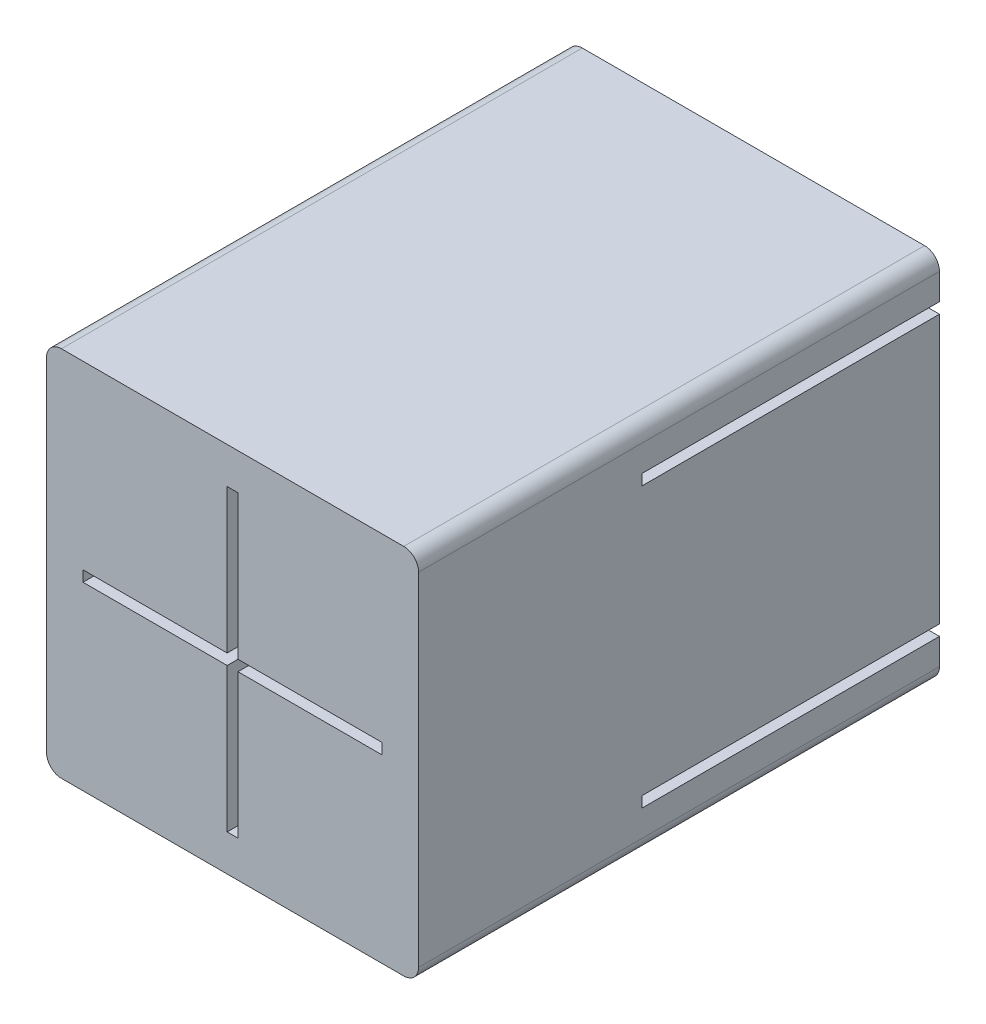
ISO-10303-21;
HEADER;
FILE_DESCRIPTION(('STEP AP214'),'2;1');
FILE_NAME('part.step','',(''),(''),'','','');
FILE_SCHEMA(('AUTOMOTIVE_DESIGN { 1 0 10303 214 1 1 1 1 }'));
ENDSEC;
DATA;
#1=APPLICATION_CONTEXT('core data for automotive mechanical design processes');
#2=APPLICATION_PROTOCOL_DEFINITION('international standard','automotive_design',2000,#1);
#3=PRODUCT_CONTEXT('',#1,'mechanical');
#4=PRODUCT('Part','Part','',(#3));
#5=PRODUCT_RELATED_PRODUCT_CATEGORY('part','',(#4));
#6=PRODUCT_DEFINITION_FORMATION('','',#4);
#7=PRODUCT_DEFINITION_CONTEXT('part definition',#1,'design');
#8=PRODUCT_DEFINITION('design','',#6,#7);
#9=PRODUCT_DEFINITION_SHAPE('','',#8);
#10=(LENGTH_UNIT() NAMED_UNIT(*) SI_UNIT(.MILLI.,.METRE.));
#11=(NAMED_UNIT(*) PLANE_ANGLE_UNIT() SI_UNIT($,.RADIAN.));
#12=(NAMED_UNIT(*) SI_UNIT($,.STERADIAN.) SOLID_ANGLE_UNIT());
#13=UNCERTAINTY_MEASURE_WITH_UNIT(LENGTH_MEASURE(1.E-05),#10,'distance_accuracy_value','');
#14=(GEOMETRIC_REPRESENTATION_CONTEXT(3) GLOBAL_UNCERTAINTY_ASSIGNED_CONTEXT((#13)) GLOBAL_UNIT_ASSIGNED_CONTEXT((#10,
#11,#12)) REPRESENTATION_CONTEXT('',''));
#15=CARTESIAN_POINT('',(0.,0.,0.));
#16=DIRECTION('',(0.,0.,1.));
#17=DIRECTION('',(1.,0.,0.));
#18=AXIS2_PLACEMENT_3D('',#15,#16,#17);
#19=CARTESIAN_POINT('',(31.75,0.,25.4));
#20=DIRECTION('',(-1.,0.,0.));
#21=DIRECTION('',(0.,0.,1.));
#22=AXIS2_PLACEMENT_3D('',#19,#20,#21);
#23=PLANE('',#22);
#24=DIRECTION('',(0.,1.,0.));
#25=VECTOR('',#24,1.);
#26=CARTESIAN_POINT('',(31.75,0.,-63.5));
#27=LINE('',#26,#25);
#28=CARTESIAN_POINT('',(31.75,24.73325,-63.5));
#29=VERTEX_POINT('',#28);
#30=CARTESIAN_POINT('',(31.75,29.21,-63.5));
#31=VERTEX_POINT('',#30);
#32=EDGE_CURVE('E300',#29,#31,#27,.T.);
#33=ORIENTED_EDGE('',*,*,#32,.T.);
#34=DIRECTION('',(0.,0.,-1.));
#35=VECTOR('',#34,1.);
#36=CARTESIAN_POINT('',(31.75,29.21,25.4));
#37=LINE('',#36,#35);
#38=CARTESIAN_POINT('',(31.75,29.21,25.4));
#39=VERTEX_POINT('',#38);
#40=EDGE_CURVE('E420',#31,#39,#37,.F.);
#41=ORIENTED_EDGE('',*,*,#40,.T.);
#42=DIRECTION('',(0.,1.,0.));
#43=VECTOR('',#42,1.);
#44=CARTESIAN_POINT('',(31.75,0.,25.4));
#45=LINE('',#44,#43);
#46=CARTESIAN_POINT('',(31.75,-29.21,25.4));
#47=VERTEX_POINT('',#46);
#48=EDGE_CURVE('E338',#47,#39,#45,.T.);
#49=ORIENTED_EDGE('',*,*,#48,.F.);
#50=DIRECTION('',(0.,0.,-1.));
#51=VECTOR('',#50,1.);
#52=CARTESIAN_POINT('',(31.75,-29.21,25.4));
#53=LINE('',#52,#51);
#54=CARTESIAN_POINT('',(31.75,-29.21,-63.5));
#55=VERTEX_POINT('',#54);
#56=EDGE_CURVE('E417',#47,#55,#53,.T.);
#57=ORIENTED_EDGE('',*,*,#56,.T.);
#58=CARTESIAN_POINT('',(31.75,-24.73325,-63.5));
#59=VERTEX_POINT('',#58);
#60=EDGE_CURVE('E301',#55,#59,#27,.T.);
#61=ORIENTED_EDGE('',*,*,#60,.T.);
#62=DIRECTION('',(0.,0.,1.));
#63=VECTOR('',#62,1.);
#64=CARTESIAN_POINT('',(31.75,-24.73325,-63.5));
#65=LINE('',#64,#63);
#66=CARTESIAN_POINT('',(31.75,-24.73325,-12.7));
#67=VERTEX_POINT('',#66);
#68=EDGE_CURVE('E285',#59,#67,#65,.T.);
#69=ORIENTED_EDGE('',*,*,#68,.T.);
#70=DIRECTION('',(0.,-1.,0.));
#71=VECTOR('',#70,1.);
#72=CARTESIAN_POINT('',(31.75,-22.89175,-12.7));
#73=LINE('',#72,#71);
#74=CARTESIAN_POINT('',(31.75,-22.89175,-12.7));
#75=VERTEX_POINT('',#74);
#76=EDGE_CURVE('E294',#75,#67,#73,.T.);
#77=ORIENTED_EDGE('',*,*,#76,.F.);
#78=DIRECTION('',(0.,0.,1.));
#79=VECTOR('',#78,1.);
#80=CARTESIAN_POINT('',(31.75,-22.89175,-63.5));
#81=LINE('',#80,#79);
#82=CARTESIAN_POINT('',(31.75,-22.89175,-63.5));
#83=VERTEX_POINT('',#82);
#84=EDGE_CURVE('E273',#83,#75,#81,.T.);
#85=ORIENTED_EDGE('',*,*,#84,.F.);
#86=CARTESIAN_POINT('',(31.75,22.89175,-63.5));
#87=VERTEX_POINT('',#86);
#88=EDGE_CURVE('E249',#83,#87,#27,.T.);
#89=ORIENTED_EDGE('',*,*,#88,.T.);
#90=DIRECTION('',(0.,0.,1.));
#91=VECTOR('',#90,1.);
#92=CARTESIAN_POINT('',(31.75,22.89175,0.));
#93=LINE('',#92,#91);
#94=CARTESIAN_POINT('',(31.75,22.89175,-12.7));
#95=VERTEX_POINT('',#94);
#96=EDGE_CURVE('E229',#87,#95,#93,.T.);
#97=ORIENTED_EDGE('',*,*,#96,.T.);
#98=DIRECTION('',(0.,1.,0.));
#99=VECTOR('',#98,1.);
#100=CARTESIAN_POINT('',(31.75,0.,-12.7));
#101=LINE('',#100,#99);
#102=CARTESIAN_POINT('',(31.75,24.73325,-12.7));
#103=VERTEX_POINT('',#102);
#104=EDGE_CURVE('E240',#95,#103,#101,.T.);
#105=ORIENTED_EDGE('',*,*,#104,.T.);
#106=DIRECTION('',(0.,0.,1.));
#107=VECTOR('',#106,1.);
#108=CARTESIAN_POINT('',(31.75,24.73325,0.));
#109=LINE('',#108,#107);
#110=EDGE_CURVE('E236',#29,#103,#109,.T.);
#111=ORIENTED_EDGE('',*,*,#110,.F.);
#112=EDGE_LOOP('',(#33,#41,#49,#57,#61,#69,#77,#85,#89,#97,#105,#111));
#113=FACE_BOUND('',#112,.T.);
#114=ADVANCED_FACE('F40',(#113),#23,.F.);
#115=CARTESIAN_POINT('',(0.,0.,-63.5));
#116=DIRECTION('',(0.,0.,1.));
#117=DIRECTION('',(1.,0.,0.));
#118=AXIS2_PLACEMENT_3D('',#115,#116,#117);
#119=PLANE('',#118);
#120=DIRECTION('',(1.,0.,0.));
#121=VECTOR('',#120,1.);
#122=CARTESIAN_POINT('',(0.,31.75,-63.5));
#123=LINE('',#122,#121);
#124=CARTESIAN_POINT('',(-29.21,31.75,-63.5));
#125=VERTEX_POINT('',#124);
#126=CARTESIAN_POINT('',(29.21,31.75,-63.5));
#127=VERTEX_POINT('',#126);
#128=EDGE_CURVE('E303',#125,#127,#123,.T.);
#129=ORIENTED_EDGE('',*,*,#128,.T.);
#130=CARTESIAN_POINT('',(29.21,29.21,-63.5));
#131=DIRECTION('',(0.,0.,1.));
#132=DIRECTION('',(1.,0.,0.));
#133=AXIS2_PLACEMENT_3D('',#130,#131,#132);
#134=CIRCLE('',#133,2.54);
#135=EDGE_CURVE('E415',#127,#31,#134,.F.);
#136=ORIENTED_EDGE('',*,*,#135,.T.);
#137=ORIENTED_EDGE('',*,*,#32,.F.);
#138=DIRECTION('',(-1.,0.,0.));
#139=VECTOR('',#138,1.);
#140=CARTESIAN_POINT('',(31.75,24.73325,-63.5));
#141=LINE('',#140,#139);
#142=CARTESIAN_POINT('',(-25.4,24.73325,-63.5));
#143=VERTEX_POINT('',#142);
#144=EDGE_CURVE('E266',#29,#143,#141,.T.);
#145=ORIENTED_EDGE('',*,*,#144,.T.);
#146=DIRECTION('',(0.,-1.,0.));
#147=VECTOR('',#146,1.);
#148=CARTESIAN_POINT('',(-25.4,0.,-63.5));
#149=LINE('',#148,#147);
#150=CARTESIAN_POINT('',(-25.4,22.89175,-63.5));
#151=VERTEX_POINT('',#150);
#152=EDGE_CURVE('E250',#143,#151,#149,.T.);
#153=ORIENTED_EDGE('',*,*,#152,.T.);
#154=DIRECTION('',(-1.,0.,0.));
#155=VECTOR('',#154,1.);
#156=CARTESIAN_POINT('',(31.75,22.89175,-63.5));
#157=LINE('',#156,#155);
#158=EDGE_CURVE('E263',#87,#151,#157,.T.);
#159=ORIENTED_EDGE('',*,*,#158,.F.);
#160=ORIENTED_EDGE('',*,*,#88,.F.);
#161=DIRECTION('',(-1.,0.,0.));
#162=VECTOR('',#161,1.);
#163=CARTESIAN_POINT('',(31.75,-22.89175,-63.5));
#164=LINE('',#163,#162);
#165=CARTESIAN_POINT('',(-25.4,-22.89175,-63.5));
#166=VERTEX_POINT('',#165);
#167=EDGE_CURVE('E279',#83,#166,#164,.T.);
#168=ORIENTED_EDGE('',*,*,#167,.T.);
#169=DIRECTION('',(0.,-1.,0.));
#170=VECTOR('',#169,1.);
#171=CARTESIAN_POINT('',(-25.4,-22.89175,-63.5));
#172=LINE('',#171,#170);
#173=CARTESIAN_POINT('',(-25.4,-24.73325,-63.5));
#174=VERTEX_POINT('',#173);
#175=EDGE_CURVE('E259',#166,#174,#172,.T.);
#176=ORIENTED_EDGE('',*,*,#175,.T.);
#177=DIRECTION('',(-1.,0.,0.));
#178=VECTOR('',#177,1.);
#179=CARTESIAN_POINT('',(31.75,-24.73325,-63.5));
#180=LINE('',#179,#178);
#181=EDGE_CURVE('E270',#59,#174,#180,.T.);
#182=ORIENTED_EDGE('',*,*,#181,.F.);
#183=ORIENTED_EDGE('',*,*,#60,.F.);
#184=CARTESIAN_POINT('',(29.21,-29.21,-63.5));
#185=DIRECTION('',(0.,0.,1.));
#186=DIRECTION('',(1.,0.,0.));
#187=AXIS2_PLACEMENT_3D('',#184,#185,#186);
#188=CIRCLE('',#187,2.54);
#189=CARTESIAN_POINT('',(29.21,-31.75,-63.5));
#190=VERTEX_POINT('',#189);
#191=EDGE_CURVE('E413',#55,#190,#188,.F.);
#192=ORIENTED_EDGE('',*,*,#191,.T.);
#193=DIRECTION('',(1.,0.,0.));
#194=VECTOR('',#193,1.);
#195=CARTESIAN_POINT('',(0.,-31.75,-63.5));
#196=LINE('',#195,#194);
#197=CARTESIAN_POINT('',(-29.21,-31.75,-63.5));
#198=VERTEX_POINT('',#197);
#199=EDGE_CURVE('E265',#198,#190,#196,.T.);
#200=ORIENTED_EDGE('',*,*,#199,.F.);
#201=CARTESIAN_POINT('',(-29.21,-29.21,-63.5));
#202=DIRECTION('',(0.,0.,1.));
#203=DIRECTION('',(1.,0.,0.));
#204=AXIS2_PLACEMENT_3D('',#201,#202,#203);
#205=CIRCLE('',#204,2.54);
#206=CARTESIAN_POINT('',(-31.75,-29.21,-63.5));
#207=VERTEX_POINT('',#206);
#208=EDGE_CURVE('E411',#198,#207,#205,.F.);
#209=ORIENTED_EDGE('',*,*,#208,.T.);
#210=DIRECTION('',(0.,1.,0.));
#211=VECTOR('',#210,1.);
#212=CARTESIAN_POINT('',(-31.75,0.,-63.5));
#213=LINE('',#212,#211);
#214=CARTESIAN_POINT('',(-31.75,29.21,-63.5));
#215=VERTEX_POINT('',#214);
#216=EDGE_CURVE('E306',#207,#215,#213,.T.);
#217=ORIENTED_EDGE('',*,*,#216,.T.);
#218=CARTESIAN_POINT('',(-29.21,29.21,-63.5));
#219=DIRECTION('',(0.,0.,1.));
#220=DIRECTION('',(1.,0.,0.));
#221=AXIS2_PLACEMENT_3D('',#218,#219,#220);
#222=CIRCLE('',#221,2.54);
#223=EDGE_CURVE('E409',#215,#125,#222,.F.);
#224=ORIENTED_EDGE('',*,*,#223,.T.);
#225=EDGE_LOOP('',(#129,#136,#137,#145,#153,#159,#160,#168,#176,#182,#183,#192,#200,#209,#217,#224));
#226=FACE_BOUND('',#225,.T.);
#227=ADVANCED_FACE('F438',(#226),#119,.F.);
#228=CARTESIAN_POINT('',(0.,-31.75,25.4));
#229=DIRECTION('',(0.,1.,0.));
#230=DIRECTION('',(0.,0.,1.));
#231=AXIS2_PLACEMENT_3D('',#228,#229,#230);
#232=PLANE('',#231);
#233=ORIENTED_EDGE('',*,*,#199,.T.);
#234=DIRECTION('',(0.,0.,-1.));
#235=VECTOR('',#234,1.);
#236=CARTESIAN_POINT('',(29.21,-31.75,25.4));
#237=LINE('',#236,#235);
#238=CARTESIAN_POINT('',(29.21,-31.75,25.4));
#239=VERTEX_POINT('',#238);
#240=EDGE_CURVE('E432',#190,#239,#237,.F.);
#241=ORIENTED_EDGE('',*,*,#240,.T.);
#242=DIRECTION('',(1.,0.,0.));
#243=VECTOR('',#242,1.);
#244=CARTESIAN_POINT('',(0.,-31.75,25.4));
#245=LINE('',#244,#243);
#246=CARTESIAN_POINT('',(-29.21,-31.75,25.4));
#247=VERTEX_POINT('',#246);
#248=EDGE_CURVE('E335',#247,#239,#245,.T.);
#249=ORIENTED_EDGE('',*,*,#248,.F.);
#250=DIRECTION('',(0.,0.,-1.));
#251=VECTOR('',#250,1.);
#252=CARTESIAN_POINT('',(-29.21,-31.75,-63.5));
#253=LINE('',#252,#251);
#254=EDGE_CURVE('E429',#247,#198,#253,.T.);
#255=ORIENTED_EDGE('',*,*,#254,.T.);
#256=EDGE_LOOP('',(#233,#241,#249,#255));
#257=FACE_BOUND('',#256,.T.);
#258=ADVANCED_FACE('F447',(#257),#232,.F.);
#259=CARTESIAN_POINT('',(0.,31.75,25.4));
#260=DIRECTION('',(0.,1.,0.));
#261=DIRECTION('',(0.,0.,1.));
#262=AXIS2_PLACEMENT_3D('',#259,#260,#261);
#263=PLANE('',#262);
#264=DIRECTION('',(1.,0.,0.));
#265=VECTOR('',#264,1.);
#266=CARTESIAN_POINT('',(0.,31.75,25.4));
#267=LINE('',#266,#265);
#268=CARTESIAN_POINT('',(-29.21,31.75,25.4));
#269=VERTEX_POINT('',#268);
#270=CARTESIAN_POINT('',(29.21,31.75,25.4));
#271=VERTEX_POINT('',#270);
#272=EDGE_CURVE('E341',#269,#271,#267,.T.);
#273=ORIENTED_EDGE('',*,*,#272,.T.);
#274=DIRECTION('',(0.,0.,-1.));
#275=VECTOR('',#274,1.);
#276=CARTESIAN_POINT('',(29.21,31.75,-63.5));
#277=LINE('',#276,#275);
#278=EDGE_CURVE('E406',#271,#127,#277,.T.);
#279=ORIENTED_EDGE('',*,*,#278,.T.);
#280=ORIENTED_EDGE('',*,*,#128,.F.);
#281=DIRECTION('',(0.,0.,-1.));
#282=VECTOR('',#281,1.);
#283=CARTESIAN_POINT('',(-29.21,31.75,25.4));
#284=LINE('',#283,#282);
#285=EDGE_CURVE('E404',#125,#269,#284,.F.);
#286=ORIENTED_EDGE('',*,*,#285,.T.);
#287=EDGE_LOOP('',(#273,#279,#280,#286));
#288=FACE_BOUND('',#287,.T.);
#289=ADVANCED_FACE('F476',(#288),#263,.T.);
#290=CARTESIAN_POINT('',(-25.527,0.,25.4));
#291=DIRECTION('',(1.,0.,0.));
#292=DIRECTION('',(0.,1.,0.));
#293=AXIS2_PLACEMENT_3D('',#290,#291,#292);
#294=PLANE('',#293);
#295=DIRECTION('',(0.,-1.,0.));
#296=VECTOR('',#295,1.);
#297=CARTESIAN_POINT('',(-25.527,0.,0.));
#298=LINE('',#297,#296);
#299=CARTESIAN_POINT('',(-25.527,0.920750000000089,0.));
#300=VERTEX_POINT('',#299);
#301=CARTESIAN_POINT('',(-25.527,-0.920749999999911,0.));
#302=VERTEX_POINT('',#301);
#303=EDGE_CURVE('E309',#300,#302,#298,.T.);
#304=ORIENTED_EDGE('',*,*,#303,.F.);
#305=DIRECTION('',(0.,0.,-1.));
#306=VECTOR('',#305,1.);
#307=CARTESIAN_POINT('',(-25.527,0.920750000000089,25.4));
#308=LINE('',#307,#306);
#309=CARTESIAN_POINT('',(-25.527,0.920750000000089,25.4));
#310=VERTEX_POINT('',#309);
#311=EDGE_CURVE('E401',#310,#300,#308,.T.);
#312=ORIENTED_EDGE('',*,*,#311,.F.);
#313=DIRECTION('',(0.,-1.,0.));
#314=VECTOR('',#313,1.);
#315=CARTESIAN_POINT('',(-25.527,0.,25.4));
#316=LINE('',#315,#314);
#317=CARTESIAN_POINT('',(-25.527,-0.920749999999911,25.4));
#318=VERTEX_POINT('',#317);
#319=EDGE_CURVE('E310',#310,#318,#316,.T.);
#320=ORIENTED_EDGE('',*,*,#319,.T.);
#321=DIRECTION('',(0.,0.,-1.));
#322=VECTOR('',#321,1.);
#323=CARTESIAN_POINT('',(-25.527,-0.920749999999911,25.4));
#324=LINE('',#323,#322);
#325=EDGE_CURVE('E346',#318,#302,#324,.T.);
#326=ORIENTED_EDGE('',*,*,#325,.T.);
#327=EDGE_LOOP('',(#304,#312,#320,#326));
#328=FACE_BOUND('',#327,.T.);
#329=ADVANCED_FACE('F525',(#328),#294,.T.);
#330=CARTESIAN_POINT('',(0.,0.92075,25.4));
#331=DIRECTION('',(0.,1.,0.));
#332=DIRECTION('',(-1.,0.,0.));
#333=AXIS2_PLACEMENT_3D('',#330,#331,#332);
#334=PLANE('',#333);
#335=DIRECTION('',(1.,0.,0.));
#336=VECTOR('',#335,1.);
#337=CARTESIAN_POINT('',(0.,0.92075,0.));
#338=LINE('',#337,#336);
#339=CARTESIAN_POINT('',(-0.92075,0.92075,0.));
#340=VERTEX_POINT('',#339);
#341=EDGE_CURVE('E348',#300,#340,#338,.T.);
#342=ORIENTED_EDGE('',*,*,#341,.T.);
#343=DIRECTION('',(0.,0.,-1.));
#344=VECTOR('',#343,1.);
#345=CARTESIAN_POINT('',(-0.92075,0.92075,25.4));
#346=LINE('',#345,#344);
#347=CARTESIAN_POINT('',(-0.92075,0.92075,25.4));
#348=VERTEX_POINT('',#347);
#349=EDGE_CURVE('E398',#348,#340,#346,.T.);
#350=ORIENTED_EDGE('',*,*,#349,.F.);
#351=DIRECTION('',(1.,0.,0.));
#352=VECTOR('',#351,1.);
#353=CARTESIAN_POINT('',(0.,0.92075,25.4));
#354=LINE('',#353,#352);
#355=EDGE_CURVE('E313',#310,#348,#354,.T.);
#356=ORIENTED_EDGE('',*,*,#355,.F.);
#357=ORIENTED_EDGE('',*,*,#311,.T.);
#358=EDGE_LOOP('',(#342,#350,#356,#357));
#359=FACE_BOUND('',#358,.T.);
#360=ADVANCED_FACE('F520',(#359),#334,.F.);
#361=CARTESIAN_POINT('',(-0.92075,0.,25.4));
#362=DIRECTION('',(-1.,0.,0.));
#363=DIRECTION('',(0.,-1.,0.));
#364=AXIS2_PLACEMENT_3D('',#361,#362,#363);
#365=PLANE('',#364);
#366=DIRECTION('',(0.,1.,0.));
#367=VECTOR('',#366,1.);
#368=CARTESIAN_POINT('',(-0.92075,0.,0.));
#369=LINE('',#368,#367);
#370=CARTESIAN_POINT('',(-0.92075,25.527,0.));
#371=VERTEX_POINT('',#370);
#372=EDGE_CURVE('E351',#340,#371,#369,.T.);
#373=ORIENTED_EDGE('',*,*,#372,.T.);
#374=DIRECTION('',(0.,0.,-1.));
#375=VECTOR('',#374,1.);
#376=CARTESIAN_POINT('',(-0.92075,25.527,25.4));
#377=LINE('',#376,#375);
#378=CARTESIAN_POINT('',(-0.92075,25.527,25.4));
#379=VERTEX_POINT('',#378);
#380=EDGE_CURVE('E395',#379,#371,#377,.T.);
#381=ORIENTED_EDGE('',*,*,#380,.F.);
#382=DIRECTION('',(0.,1.,0.));
#383=VECTOR('',#382,1.);
#384=CARTESIAN_POINT('',(-0.92075,0.,25.4));
#385=LINE('',#384,#383);
#386=EDGE_CURVE('E316',#348,#379,#385,.T.);
#387=ORIENTED_EDGE('',*,*,#386,.F.);
#388=ORIENTED_EDGE('',*,*,#349,.T.);
#389=EDGE_LOOP('',(#373,#381,#387,#388));
#390=FACE_BOUND('',#389,.T.);
#391=ADVANCED_FACE('F503',(#390),#365,.F.);
#392=CARTESIAN_POINT('',(0.,25.527,25.4));
#393=DIRECTION('',(0.,1.,0.));
#394=DIRECTION('',(0.,0.,1.));
#395=AXIS2_PLACEMENT_3D('',#392,#393,#394);
#396=PLANE('',#395);
#397=DIRECTION('',(1.,0.,0.));
#398=VECTOR('',#397,1.);
#399=CARTESIAN_POINT('',(0.,25.527,0.));
#400=LINE('',#399,#398);
#401=CARTESIAN_POINT('',(0.92075,25.527,0.));
#402=VERTEX_POINT('',#401);
#403=EDGE_CURVE('E355',#371,#402,#400,.T.);
#404=ORIENTED_EDGE('',*,*,#403,.T.);
#405=DIRECTION('',(0.,0.,-1.));
#406=VECTOR('',#405,1.);
#407=CARTESIAN_POINT('',(0.92075,25.527,25.4));
#408=LINE('',#407,#406);
#409=CARTESIAN_POINT('',(0.92075,25.527,25.4));
#410=VERTEX_POINT('',#409);
#411=EDGE_CURVE('E392',#410,#402,#408,.T.);
#412=ORIENTED_EDGE('',*,*,#411,.F.);
#413=DIRECTION('',(1.,0.,0.));
#414=VECTOR('',#413,1.);
#415=CARTESIAN_POINT('',(0.,25.527,25.4));
#416=LINE('',#415,#414);
#417=EDGE_CURVE('E319',#379,#410,#416,.T.);
#418=ORIENTED_EDGE('',*,*,#417,.F.);
#419=ORIENTED_EDGE('',*,*,#380,.T.);
#420=EDGE_LOOP('',(#404,#412,#418,#419));
#421=FACE_BOUND('',#420,.T.);
#422=ADVANCED_FACE('F521',(#421),#396,.F.);
#423=CARTESIAN_POINT('',(0.92075,0.,25.4));
#424=DIRECTION('',(-1.,0.,0.));
#425=DIRECTION('',(0.,0.,1.));
#426=AXIS2_PLACEMENT_3D('',#423,#424,#425);
#427=PLANE('',#426);
#428=DIRECTION('',(0.,1.,0.));
#429=VECTOR('',#428,1.);
#430=CARTESIAN_POINT('',(0.92075,0.,0.));
#431=LINE('',#430,#429);
#432=CARTESIAN_POINT('',(0.92075,0.92075,0.));
#433=VERTEX_POINT('',#432);
#434=EDGE_CURVE('E359',#433,#402,#431,.T.);
#435=ORIENTED_EDGE('',*,*,#434,.F.);
#436=DIRECTION('',(0.,0.,-1.));
#437=VECTOR('',#436,1.);
#438=CARTESIAN_POINT('',(0.92075,0.92075,25.4));
#439=LINE('',#438,#437);
#440=CARTESIAN_POINT('',(0.92075,0.92075,25.4));
#441=VERTEX_POINT('',#440);
#442=EDGE_CURVE('E389',#441,#433,#439,.T.);
#443=ORIENTED_EDGE('',*,*,#442,.F.);
#444=DIRECTION('',(0.,1.,0.));
#445=VECTOR('',#444,1.);
#446=CARTESIAN_POINT('',(0.92075,0.,25.4));
#447=LINE('',#446,#445);
#448=EDGE_CURVE('E322',#441,#410,#447,.T.);
#449=ORIENTED_EDGE('',*,*,#448,.T.);
#450=ORIENTED_EDGE('',*,*,#411,.T.);
#451=EDGE_LOOP('',(#435,#443,#449,#450));
#452=FACE_BOUND('',#451,.T.);
#453=ADVANCED_FACE('F511',(#452),#427,.T.);
#454=CARTESIAN_POINT('',(25.527,0.920749999999911,0.));
#455=VERTEX_POINT('',#454);
#456=EDGE_CURVE('E352',#433,#455,#338,.T.);
#457=ORIENTED_EDGE('',*,*,#456,.T.);
#458=DIRECTION('',(0.,0.,-1.));
#459=VECTOR('',#458,1.);
#460=CARTESIAN_POINT('',(25.527,0.920749999999911,25.4));
#461=LINE('',#460,#459);
#462=CARTESIAN_POINT('',(25.527,0.920749999999911,25.4));
#463=VERTEX_POINT('',#462);
#464=EDGE_CURVE('E386',#463,#455,#461,.T.);
#465=ORIENTED_EDGE('',*,*,#464,.F.);
#466=EDGE_CURVE('E317',#441,#463,#354,.T.);
#467=ORIENTED_EDGE('',*,*,#466,.F.);
#468=ORIENTED_EDGE('',*,*,#442,.T.);
#469=EDGE_LOOP('',(#457,#465,#467,#468));
#470=FACE_BOUND('',#469,.T.);
#471=ADVANCED_FACE('F515',(#470),#334,.F.);
#472=CARTESIAN_POINT('',(25.527,0.,25.4));
#473=DIRECTION('',(1.,0.,0.));
#474=DIRECTION('',(0.,1.,0.));
#475=AXIS2_PLACEMENT_3D('',#472,#473,#474);
#476=PLANE('',#475);
#477=DIRECTION('',(0.,-1.,0.));
#478=VECTOR('',#477,1.);
#479=CARTESIAN_POINT('',(25.527,0.,0.));
#480=LINE('',#479,#478);
#481=CARTESIAN_POINT('',(25.527,-0.920750000000089,0.));
#482=VERTEX_POINT('',#481);
#483=EDGE_CURVE('E362',#455,#482,#480,.T.);
#484=ORIENTED_EDGE('',*,*,#483,.T.);
#485=DIRECTION('',(0.,0.,-1.));
#486=VECTOR('',#485,1.);
#487=CARTESIAN_POINT('',(25.527,-0.920750000000089,25.4));
#488=LINE('',#487,#486);
#489=CARTESIAN_POINT('',(25.527,-0.920750000000089,25.4));
#490=VERTEX_POINT('',#489);
#491=EDGE_CURVE('E383',#490,#482,#488,.T.);
#492=ORIENTED_EDGE('',*,*,#491,.F.);
#493=DIRECTION('',(0.,-1.,0.));
#494=VECTOR('',#493,1.);
#495=CARTESIAN_POINT('',(25.527,0.,25.4));
#496=LINE('',#495,#494);
#497=EDGE_CURVE('E326',#463,#490,#496,.T.);
#498=ORIENTED_EDGE('',*,*,#497,.F.);
#499=ORIENTED_EDGE('',*,*,#464,.T.);
#500=EDGE_LOOP('',(#484,#492,#498,#499));
#501=FACE_BOUND('',#500,.T.);
#502=ADVANCED_FACE('F512',(#501),#476,.F.);
#503=CARTESIAN_POINT('',(0.,-0.92075,25.4));
#504=DIRECTION('',(0.,1.,0.));
#505=DIRECTION('',(-1.,0.,0.));
#506=AXIS2_PLACEMENT_3D('',#503,#504,#505);
#507=PLANE('',#506);
#508=DIRECTION('',(1.,0.,0.));
#509=VECTOR('',#508,1.);
#510=CARTESIAN_POINT('',(0.,-0.92075,0.));
#511=LINE('',#510,#509);
#512=CARTESIAN_POINT('',(0.92075,-0.920750000000003,0.));
#513=VERTEX_POINT('',#512);
#514=EDGE_CURVE('E365',#513,#482,#511,.T.);
#515=ORIENTED_EDGE('',*,*,#514,.F.);
#516=DIRECTION('',(0.,0.,-1.));
#517=VECTOR('',#516,1.);
#518=CARTESIAN_POINT('',(0.92075,-0.920750000000003,25.4));
#519=LINE('',#518,#517);
#520=CARTESIAN_POINT('',(0.92075,-0.920750000000003,25.4));
#521=VERTEX_POINT('',#520);
#522=EDGE_CURVE('E380',#521,#513,#519,.T.);
#523=ORIENTED_EDGE('',*,*,#522,.F.);
#524=DIRECTION('',(1.,0.,0.));
#525=VECTOR('',#524,1.);
#526=CARTESIAN_POINT('',(0.,-0.92075,25.4));
#527=LINE('',#526,#525);
#528=EDGE_CURVE('E328',#521,#490,#527,.T.);
#529=ORIENTED_EDGE('',*,*,#528,.T.);
#530=ORIENTED_EDGE('',*,*,#491,.T.);
#531=EDGE_LOOP('',(#515,#523,#529,#530));
#532=FACE_BOUND('',#531,.T.);
#533=ADVANCED_FACE('F498',(#532),#507,.T.);
#534=CARTESIAN_POINT('',(0.92075,-25.527,0.));
#535=VERTEX_POINT('',#534);
#536=EDGE_CURVE('E361',#535,#513,#431,.T.);
#537=ORIENTED_EDGE('',*,*,#536,.F.);
#538=DIRECTION('',(0.,0.,-1.));
#539=VECTOR('',#538,1.);
#540=CARTESIAN_POINT('',(0.92075,-25.527,25.4));
#541=LINE('',#540,#539);
#542=CARTESIAN_POINT('',(0.92075,-25.527,25.4));
#543=VERTEX_POINT('',#542);
#544=EDGE_CURVE('E377',#543,#535,#541,.T.);
#545=ORIENTED_EDGE('',*,*,#544,.F.);
#546=EDGE_CURVE('E325',#543,#521,#447,.T.);
#547=ORIENTED_EDGE('',*,*,#546,.T.);
#548=ORIENTED_EDGE('',*,*,#522,.T.);
#549=EDGE_LOOP('',(#537,#545,#547,#548));
#550=FACE_BOUND('',#549,.T.);
#551=ADVANCED_FACE('F506',(#550),#427,.T.);
#552=CARTESIAN_POINT('',(0.,-25.527,25.4));
#553=DIRECTION('',(0.,1.,0.));
#554=DIRECTION('',(0.,0.,1.));
#555=AXIS2_PLACEMENT_3D('',#552,#553,#554);
#556=PLANE('',#555);
#557=DIRECTION('',(1.,0.,0.));
#558=VECTOR('',#557,1.);
#559=CARTESIAN_POINT('',(0.,-25.527,0.));
#560=LINE('',#559,#558);
#561=CARTESIAN_POINT('',(-0.92075,-25.527,0.));
#562=VERTEX_POINT('',#561);
#563=EDGE_CURVE('E367',#562,#535,#560,.T.);
#564=ORIENTED_EDGE('',*,*,#563,.F.);
#565=DIRECTION('',(0.,0.,-1.));
#566=VECTOR('',#565,1.);
#567=CARTESIAN_POINT('',(-0.92075,-25.527,25.4));
#568=LINE('',#567,#566);
#569=CARTESIAN_POINT('',(-0.92075,-25.527,25.4));
#570=VERTEX_POINT('',#569);
#571=EDGE_CURVE('E374',#570,#562,#568,.T.);
#572=ORIENTED_EDGE('',*,*,#571,.F.);
#573=DIRECTION('',(1.,0.,0.));
#574=VECTOR('',#573,1.);
#575=CARTESIAN_POINT('',(0.,-25.527,25.4));
#576=LINE('',#575,#574);
#577=EDGE_CURVE('E332',#570,#543,#576,.T.);
#578=ORIENTED_EDGE('',*,*,#577,.T.);
#579=ORIENTED_EDGE('',*,*,#544,.T.);
#580=EDGE_LOOP('',(#564,#572,#578,#579));
#581=FACE_BOUND('',#580,.T.);
#582=ADVANCED_FACE('F501',(#581),#556,.T.);
#583=CARTESIAN_POINT('',(-0.92075,-0.920749999999997,0.));
#584=VERTEX_POINT('',#583);
#585=EDGE_CURVE('E356',#562,#584,#369,.T.);
#586=ORIENTED_EDGE('',*,*,#585,.T.);
#587=DIRECTION('',(0.,0.,-1.));
#588=VECTOR('',#587,1.);
#589=CARTESIAN_POINT('',(-0.92075,-0.920749999999997,25.4));
#590=LINE('',#589,#588);
#591=CARTESIAN_POINT('',(-0.92075,-0.920749999999997,25.4));
#592=VERTEX_POINT('',#591);
#593=EDGE_CURVE('E371',#592,#584,#590,.T.);
#594=ORIENTED_EDGE('',*,*,#593,.F.);
#595=EDGE_CURVE('E320',#570,#592,#385,.T.);
#596=ORIENTED_EDGE('',*,*,#595,.F.);
#597=ORIENTED_EDGE('',*,*,#571,.T.);
#598=EDGE_LOOP('',(#586,#594,#596,#597));
#599=FACE_BOUND('',#598,.T.);
#600=ADVANCED_FACE('F496',(#599),#365,.F.);
#601=EDGE_CURVE('E314',#302,#584,#511,.T.);
#602=ORIENTED_EDGE('',*,*,#601,.F.);
#603=ORIENTED_EDGE('',*,*,#325,.F.);
#604=EDGE_CURVE('E331',#318,#592,#527,.T.);
#605=ORIENTED_EDGE('',*,*,#604,.T.);
#606=ORIENTED_EDGE('',*,*,#593,.T.);
#607=EDGE_LOOP('',(#602,#603,#605,#606));
#608=FACE_BOUND('',#607,.T.);
#609=ADVANCED_FACE('F493',(#608),#507,.T.);
#610=CARTESIAN_POINT('',(-31.75,0.,25.4));
#611=DIRECTION('',(-1.,0.,0.));
#612=DIRECTION('',(0.,0.,1.));
#613=AXIS2_PLACEMENT_3D('',#610,#611,#612);
#614=PLANE('',#613);
#615=ORIENTED_EDGE('',*,*,#216,.F.);
#616=DIRECTION('',(0.,0.,-1.));
#617=VECTOR('',#616,1.);
#618=CARTESIAN_POINT('',(-31.75,-29.21,25.4));
#619=LINE('',#618,#617);
#620=CARTESIAN_POINT('',(-31.75,-29.21,25.4));
#621=VERTEX_POINT('',#620);
#622=EDGE_CURVE('E11',#207,#621,#619,.F.);
#623=ORIENTED_EDGE('',*,*,#622,.T.);
#624=DIRECTION('',(0.,1.,0.));
#625=VECTOR('',#624,1.);
#626=CARTESIAN_POINT('',(-31.75,0.,25.4));
#627=LINE('',#626,#625);
#628=CARTESIAN_POINT('',(-31.75,29.21,25.4));
#629=VERTEX_POINT('',#628);
#630=EDGE_CURVE('E344',#621,#629,#627,.T.);
#631=ORIENTED_EDGE('',*,*,#630,.T.);
#632=DIRECTION('',(0.,0.,-1.));
#633=VECTOR('',#632,1.);
#634=CARTESIAN_POINT('',(-31.75,29.21,25.4));
#635=LINE('',#634,#633);
#636=EDGE_CURVE('E48',#629,#215,#635,.T.);
#637=ORIENTED_EDGE('',*,*,#636,.T.);
#638=EDGE_LOOP('',(#615,#623,#631,#637));
#639=FACE_BOUND('',#638,.T.);
#640=ADVANCED_FACE('F435',(#639),#614,.T.);
#641=CARTESIAN_POINT('',(0.,0.,25.4));
#642=DIRECTION('',(0.,0.,1.));
#643=DIRECTION('',(1.,0.,0.));
#644=AXIS2_PLACEMENT_3D('',#641,#642,#643);
#645=PLANE('',#644);
#646=ORIENTED_EDGE('',*,*,#319,.F.);
#647=ORIENTED_EDGE('',*,*,#355,.T.);
#648=ORIENTED_EDGE('',*,*,#386,.T.);
#649=ORIENTED_EDGE('',*,*,#417,.T.);
#650=ORIENTED_EDGE('',*,*,#448,.F.);
#651=ORIENTED_EDGE('',*,*,#466,.T.);
#652=ORIENTED_EDGE('',*,*,#497,.T.);
#653=ORIENTED_EDGE('',*,*,#528,.F.);
#654=ORIENTED_EDGE('',*,*,#546,.F.);
#655=ORIENTED_EDGE('',*,*,#577,.F.);
#656=ORIENTED_EDGE('',*,*,#595,.T.);
#657=ORIENTED_EDGE('',*,*,#604,.F.);
#658=EDGE_LOOP('',(#646,#647,#648,#649,#650,#651,#652,#653,#654,#655,#656,#657));
#659=FACE_BOUND('',#658,.T.);
#660=ORIENTED_EDGE('',*,*,#48,.T.);
#661=CARTESIAN_POINT('',(29.21,29.21,25.4));
#662=DIRECTION('',(0.,0.,1.));
#663=DIRECTION('',(1.,0.,0.));
#664=AXIS2_PLACEMENT_3D('',#661,#662,#663);
#665=CIRCLE('',#664,2.54);
#666=EDGE_CURVE('E427',#39,#271,#665,.T.);
#667=ORIENTED_EDGE('',*,*,#666,.T.);
#668=ORIENTED_EDGE('',*,*,#272,.F.);
#669=CARTESIAN_POINT('',(-29.21,29.21,25.4));
#670=DIRECTION('',(0.,0.,1.));
#671=DIRECTION('',(1.,0.,0.));
#672=AXIS2_PLACEMENT_3D('',#669,#670,#671);
#673=CIRCLE('',#672,2.54);
#674=EDGE_CURVE('E55',#269,#629,#673,.T.);
#675=ORIENTED_EDGE('',*,*,#674,.T.);
#676=ORIENTED_EDGE('',*,*,#630,.F.);
#677=CARTESIAN_POINT('',(-29.21,-29.21,25.4));
#678=DIRECTION('',(0.,0.,1.));
#679=DIRECTION('',(1.,0.,0.));
#680=AXIS2_PLACEMENT_3D('',#677,#678,#679);
#681=CIRCLE('',#680,2.54);
#682=EDGE_CURVE('E423',#621,#247,#681,.T.);
#683=ORIENTED_EDGE('',*,*,#682,.T.);
#684=ORIENTED_EDGE('',*,*,#248,.T.);
#685=CARTESIAN_POINT('',(29.21,-29.21,25.4));
#686=DIRECTION('',(0.,0.,1.));
#687=DIRECTION('',(1.,0.,0.));
#688=AXIS2_PLACEMENT_3D('',#685,#686,#687);
#689=CIRCLE('',#688,2.54);
#690=EDGE_CURVE('E425',#239,#47,#689,.T.);
#691=ORIENTED_EDGE('',*,*,#690,.T.);
#692=EDGE_LOOP('',(#660,#667,#668,#675,#676,#683,#684,#691));
#693=FACE_BOUND('',#692,.T.);
#694=ADVANCED_FACE('F450',(#659,#693),#645,.T.);
#695=CARTESIAN_POINT('',(0.,0.,0.));
#696=DIRECTION('',(0.,0.,1.));
#697=DIRECTION('',(1.,0.,0.));
#698=AXIS2_PLACEMENT_3D('',#695,#696,#697);
#699=PLANE('',#698);
#700=ORIENTED_EDGE('',*,*,#341,.F.);
#701=ORIENTED_EDGE('',*,*,#303,.T.);
#702=ORIENTED_EDGE('',*,*,#601,.T.);
#703=ORIENTED_EDGE('',*,*,#585,.F.);
#704=ORIENTED_EDGE('',*,*,#563,.T.);
#705=ORIENTED_EDGE('',*,*,#536,.T.);
#706=ORIENTED_EDGE('',*,*,#514,.T.);
#707=ORIENTED_EDGE('',*,*,#483,.F.);
#708=ORIENTED_EDGE('',*,*,#456,.F.);
#709=ORIENTED_EDGE('',*,*,#434,.T.);
#710=ORIENTED_EDGE('',*,*,#403,.F.);
#711=ORIENTED_EDGE('',*,*,#372,.F.);
#712=EDGE_LOOP('',(#700,#701,#702,#703,#704,#705,#706,#707,#708,#709,#710,#711));
#713=FACE_BOUND('',#712,.T.);
#714=ADVANCED_FACE('F628',(#713),#699,.T.);
#715=CARTESIAN_POINT('',(31.75,-22.89175,-63.5));
#716=DIRECTION('',(0.,-1.,0.));
#717=DIRECTION('',(0.,0.,-1.));
#718=AXIS2_PLACEMENT_3D('',#715,#716,#717);
#719=PLANE('',#718);
#720=DIRECTION('',(0.,0.,1.));
#721=VECTOR('',#720,1.);
#722=CARTESIAN_POINT('',(-25.4,-22.89175,-63.5));
#723=LINE('',#722,#721);
#724=CARTESIAN_POINT('',(-25.4,-22.89175,-12.7));
#725=VERTEX_POINT('',#724);
#726=EDGE_CURVE('E282',#166,#725,#723,.T.);
#727=ORIENTED_EDGE('',*,*,#726,.F.);
#728=ORIENTED_EDGE('',*,*,#167,.F.);
#729=ORIENTED_EDGE('',*,*,#84,.T.);
#730=DIRECTION('',(-1.,0.,0.));
#731=VECTOR('',#730,1.);
#732=CARTESIAN_POINT('',(31.75,-22.89175,-12.7));
#733=LINE('',#732,#731);
#734=EDGE_CURVE('E276',#75,#725,#733,.T.);
#735=ORIENTED_EDGE('',*,*,#734,.T.);
#736=EDGE_LOOP('',(#727,#728,#729,#735));
#737=FACE_BOUND('',#736,.T.);
#738=ADVANCED_FACE('F468',(#737),#719,.T.);
#739=CARTESIAN_POINT('',(31.75,-22.89175,-12.7));
#740=DIRECTION('',(0.,0.,-1.));
#741=DIRECTION('',(-1.,0.,0.));
#742=AXIS2_PLACEMENT_3D('',#739,#740,#741);
#743=PLANE('',#742);
#744=DIRECTION('',(0.,-1.,0.));
#745=VECTOR('',#744,1.);
#746=CARTESIAN_POINT('',(-25.4,-22.89175,-12.7));
#747=LINE('',#746,#745);
#748=CARTESIAN_POINT('',(-25.4,-24.73325,-12.7));
#749=VERTEX_POINT('',#748);
#750=EDGE_CURVE('E284',#725,#749,#747,.T.);
#751=ORIENTED_EDGE('',*,*,#750,.F.);
#752=ORIENTED_EDGE('',*,*,#734,.F.);
#753=ORIENTED_EDGE('',*,*,#76,.T.);
#754=DIRECTION('',(-1.,0.,0.));
#755=VECTOR('',#754,1.);
#756=CARTESIAN_POINT('',(31.75,-24.73325,-12.7));
#757=LINE('',#756,#755);
#758=EDGE_CURVE('E274',#67,#749,#757,.T.);
#759=ORIENTED_EDGE('',*,*,#758,.T.);
#760=EDGE_LOOP('',(#751,#752,#753,#759));
#761=FACE_BOUND('',#760,.T.);
#762=ADVANCED_FACE('F466',(#761),#743,.T.);
#763=CARTESIAN_POINT('',(31.75,-24.73325,-63.5));
#764=DIRECTION('',(0.,-1.,0.));
#765=DIRECTION('',(0.,0.,-1.));
#766=AXIS2_PLACEMENT_3D('',#763,#764,#765);
#767=PLANE('',#766);
#768=DIRECTION('',(0.,0.,1.));
#769=VECTOR('',#768,1.);
#770=CARTESIAN_POINT('',(-25.4,-24.73325,-63.5));
#771=LINE('',#770,#769);
#772=EDGE_CURVE('E288',#174,#749,#771,.T.);
#773=ORIENTED_EDGE('',*,*,#772,.T.);
#774=ORIENTED_EDGE('',*,*,#758,.F.);
#775=ORIENTED_EDGE('',*,*,#68,.F.);
#776=ORIENTED_EDGE('',*,*,#181,.T.);
#777=EDGE_LOOP('',(#773,#774,#775,#776));
#778=FACE_BOUND('',#777,.T.);
#779=ADVANCED_FACE('F460',(#778),#767,.F.);
#780=CARTESIAN_POINT('',(-25.4,0.,0.));
#781=DIRECTION('',(-1.,0.,0.));
#782=DIRECTION('',(0.,0.,1.));
#783=AXIS2_PLACEMENT_3D('',#780,#781,#782);
#784=PLANE('',#783);
#785=ORIENTED_EDGE('',*,*,#175,.F.);
#786=ORIENTED_EDGE('',*,*,#726,.T.);
#787=ORIENTED_EDGE('',*,*,#750,.T.);
#788=ORIENTED_EDGE('',*,*,#772,.F.);
#789=EDGE_LOOP('',(#785,#786,#787,#788));
#790=FACE_BOUND('',#789,.T.);
#791=ADVANCED_FACE('F594',(#790),#784,.F.);
#792=CARTESIAN_POINT('',(31.75,22.89175,0.));
#793=DIRECTION('',(0.,-1.,0.));
#794=DIRECTION('',(0.,0.,-1.));
#795=AXIS2_PLACEMENT_3D('',#792,#793,#794);
#796=PLANE('',#795);
#797=DIRECTION('',(0.,0.,1.));
#798=VECTOR('',#797,1.);
#799=CARTESIAN_POINT('',(-25.4,22.89175,0.));
#800=LINE('',#799,#798);
#801=CARTESIAN_POINT('',(-25.4,22.89175,-12.7));
#802=VERTEX_POINT('',#801);
#803=EDGE_CURVE('E231',#151,#802,#800,.T.);
#804=ORIENTED_EDGE('',*,*,#803,.T.);
#805=DIRECTION('',(-1.,0.,0.));
#806=VECTOR('',#805,1.);
#807=CARTESIAN_POINT('',(31.75,22.89175,-12.7));
#808=LINE('',#807,#806);
#809=EDGE_CURVE('E224',#95,#802,#808,.T.);
#810=ORIENTED_EDGE('',*,*,#809,.F.);
#811=ORIENTED_EDGE('',*,*,#96,.F.);
#812=ORIENTED_EDGE('',*,*,#158,.T.);
#813=EDGE_LOOP('',(#804,#810,#811,#812));
#814=FACE_BOUND('',#813,.T.);
#815=ADVANCED_FACE('F226',(#814),#796,.F.);
#816=CARTESIAN_POINT('',(31.75,24.73325,0.));
#817=DIRECTION('',(0.,-1.,0.));
#818=DIRECTION('',(0.,0.,-1.));
#819=AXIS2_PLACEMENT_3D('',#816,#817,#818);
#820=PLANE('',#819);
#821=DIRECTION('',(0.,0.,1.));
#822=VECTOR('',#821,1.);
#823=CARTESIAN_POINT('',(-25.4,24.73325,0.));
#824=LINE('',#823,#822);
#825=CARTESIAN_POINT('',(-25.4,24.73325,-12.7));
#826=VERTEX_POINT('',#825);
#827=EDGE_CURVE('E253',#143,#826,#824,.T.);
#828=ORIENTED_EDGE('',*,*,#827,.F.);
#829=ORIENTED_EDGE('',*,*,#144,.F.);
#830=ORIENTED_EDGE('',*,*,#110,.T.);
#831=DIRECTION('',(-1.,0.,0.));
#832=VECTOR('',#831,1.);
#833=CARTESIAN_POINT('',(31.75,24.73325,-12.7));
#834=LINE('',#833,#832);
#835=EDGE_CURVE('E235',#103,#826,#834,.T.);
#836=ORIENTED_EDGE('',*,*,#835,.T.);
#837=EDGE_LOOP('',(#828,#829,#830,#836));
#838=FACE_BOUND('',#837,.T.);
#839=ADVANCED_FACE('F576',(#838),#820,.T.);
#840=CARTESIAN_POINT('',(31.75,0.,-12.7));
#841=DIRECTION('',(0.,0.,1.));
#842=DIRECTION('',(1.,0.,0.));
#843=AXIS2_PLACEMENT_3D('',#840,#841,#842);
#844=PLANE('',#843);
#845=DIRECTION('',(0.,1.,0.));
#846=VECTOR('',#845,1.);
#847=CARTESIAN_POINT('',(-25.4,0.,-12.7));
#848=LINE('',#847,#846);
#849=EDGE_CURVE('E258',#802,#826,#848,.T.);
#850=ORIENTED_EDGE('',*,*,#849,.T.);
#851=ORIENTED_EDGE('',*,*,#835,.F.);
#852=ORIENTED_EDGE('',*,*,#104,.F.);
#853=ORIENTED_EDGE('',*,*,#809,.T.);
#854=EDGE_LOOP('',(#850,#851,#852,#853));
#855=FACE_BOUND('',#854,.T.);
#856=ADVANCED_FACE('F241',(#855),#844,.F.);
#857=CARTESIAN_POINT('',(-25.4,0.,0.));
#858=DIRECTION('',(-1.,0.,0.));
#859=DIRECTION('',(0.,0.,1.));
#860=AXIS2_PLACEMENT_3D('',#857,#858,#859);
#861=PLANE('',#860);
#862=ORIENTED_EDGE('',*,*,#803,.F.);
#863=ORIENTED_EDGE('',*,*,#152,.F.);
#864=ORIENTED_EDGE('',*,*,#827,.T.);
#865=ORIENTED_EDGE('',*,*,#849,.F.);
#866=EDGE_LOOP('',(#862,#863,#864,#865));
#867=FACE_BOUND('',#866,.T.);
#868=ADVANCED_FACE('F531',(#867),#861,.F.);
#869=CARTESIAN_POINT('',(29.21,29.21,25.4));
#870=DIRECTION('',(0.,0.,1.));
#871=DIRECTION('',(1.,0.,0.));
#872=AXIS2_PLACEMENT_3D('',#869,#870,#871);
#873=CYLINDRICAL_SURFACE('',#872,2.54);
#874=ORIENTED_EDGE('',*,*,#666,.F.);
#875=ORIENTED_EDGE('',*,*,#40,.F.);
#876=ORIENTED_EDGE('',*,*,#135,.F.);
#877=ORIENTED_EDGE('',*,*,#278,.F.);
#878=EDGE_LOOP('',(#874,#875,#876,#877));
#879=FACE_BOUND('',#878,.T.);
#880=ADVANCED_FACE('F473',(#879),#873,.T.);
#881=CARTESIAN_POINT('',(29.21,-29.21,25.4));
#882=DIRECTION('',(0.,0.,-1.));
#883=DIRECTION('',(-1.,0.,0.));
#884=AXIS2_PLACEMENT_3D('',#881,#882,#883);
#885=CYLINDRICAL_SURFACE('',#884,2.54);
#886=ORIENTED_EDGE('',*,*,#690,.F.);
#887=ORIENTED_EDGE('',*,*,#240,.F.);
#888=ORIENTED_EDGE('',*,*,#191,.F.);
#889=ORIENTED_EDGE('',*,*,#56,.F.);
#890=EDGE_LOOP('',(#886,#887,#888,#889));
#891=FACE_BOUND('',#890,.T.);
#892=ADVANCED_FACE('F454',(#891),#885,.T.);
#893=CARTESIAN_POINT('',(-29.21,-29.21,25.4));
#894=DIRECTION('',(0.,0.,1.));
#895=DIRECTION('',(1.,0.,0.));
#896=AXIS2_PLACEMENT_3D('',#893,#894,#895);
#897=CYLINDRICAL_SURFACE('',#896,2.54);
#898=ORIENTED_EDGE('',*,*,#682,.F.);
#899=ORIENTED_EDGE('',*,*,#622,.F.);
#900=ORIENTED_EDGE('',*,*,#208,.F.);
#901=ORIENTED_EDGE('',*,*,#254,.F.);
#902=EDGE_LOOP('',(#898,#899,#900,#901));
#903=FACE_BOUND('',#902,.T.);
#904=ADVANCED_FACE('F444',(#903),#897,.T.);
#905=CARTESIAN_POINT('',(-29.21,29.21,25.4));
#906=DIRECTION('',(0.,0.,-1.));
#907=DIRECTION('',(-1.,0.,0.));
#908=AXIS2_PLACEMENT_3D('',#905,#906,#907);
#909=CYLINDRICAL_SURFACE('',#908,2.54);
#910=ORIENTED_EDGE('',*,*,#674,.F.);
#911=ORIENTED_EDGE('',*,*,#285,.F.);
#912=ORIENTED_EDGE('',*,*,#223,.F.);
#913=ORIENTED_EDGE('',*,*,#636,.F.);
#914=EDGE_LOOP('',(#910,#911,#912,#913));
#915=FACE_BOUND('',#914,.T.);
#916=ADVANCED_FACE('F42',(#915),#909,.T.);
#917=CLOSED_SHELL('',(#114,#227,#258,#289,#329,#360,#391,#422,#453,#471,#502,#533,#551,#582,
#600,#609,#640,#694,#714,#738,#762,#779,#791,#815,#839,#856,#868,#880,#892,#904,#916));
#918=MANIFOLD_SOLID_BREP('B2',#917);
#919=ADVANCED_BREP_SHAPE_REPRESENTATION('',(#18,#918),#14);
#920=SHAPE_DEFINITION_REPRESENTATION(#9,#919);
ENDSEC;
END-ISO-10303-21;
